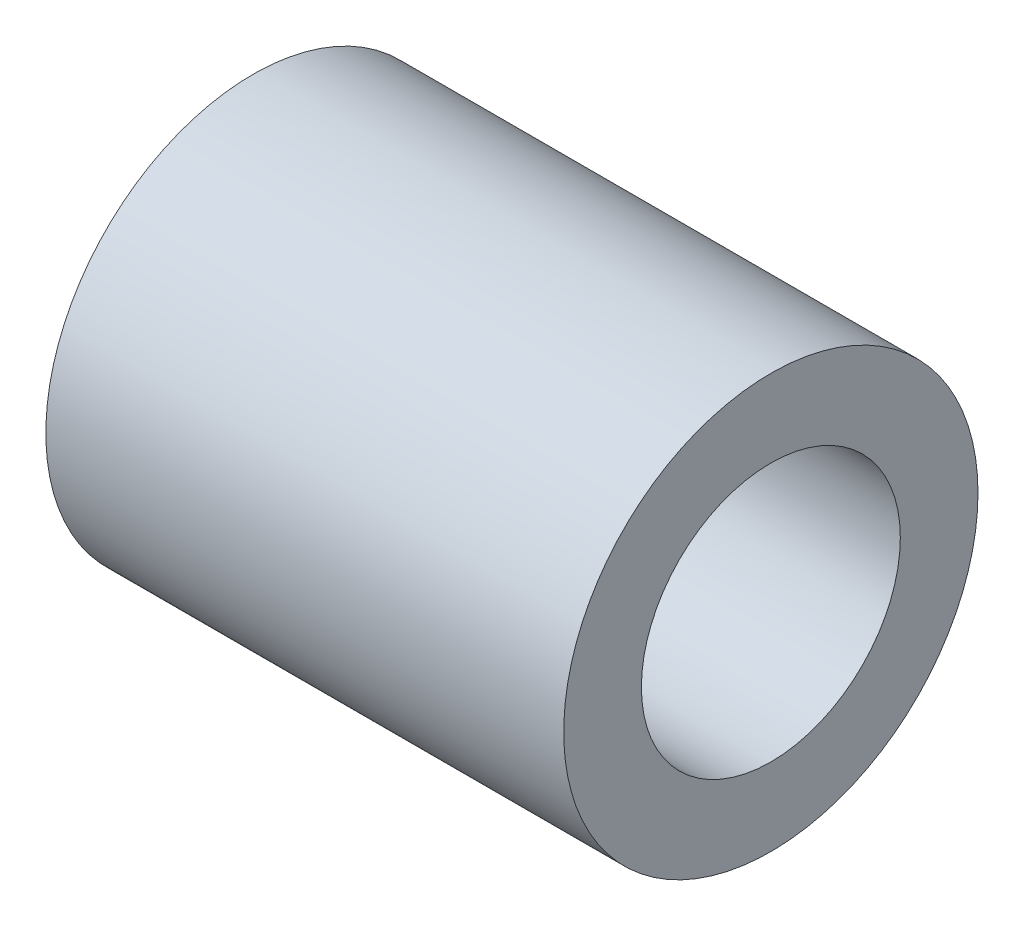
ISO-10303-21;
HEADER;
FILE_DESCRIPTION(('STEP AP214'),'2;1');
FILE_NAME('part.step','',(''),(''),'','','');
FILE_SCHEMA(('AUTOMOTIVE_DESIGN { 1 0 10303 214 1 1 1 1 }'));
ENDSEC;
DATA;
#1=APPLICATION_CONTEXT('core data for automotive mechanical design processes');
#2=APPLICATION_PROTOCOL_DEFINITION('international standard','automotive_design',2000,#1);
#3=PRODUCT_CONTEXT('',#1,'mechanical');
#4=PRODUCT('Part','Part','',(#3));
#5=PRODUCT_RELATED_PRODUCT_CATEGORY('part','',(#4));
#6=PRODUCT_DEFINITION_FORMATION('','',#4);
#7=PRODUCT_DEFINITION_CONTEXT('part definition',#1,'design');
#8=PRODUCT_DEFINITION('design','',#6,#7);
#9=PRODUCT_DEFINITION_SHAPE('','',#8);
#10=(LENGTH_UNIT() NAMED_UNIT(*) SI_UNIT(.MILLI.,.METRE.));
#11=(NAMED_UNIT(*) PLANE_ANGLE_UNIT() SI_UNIT($,.RADIAN.));
#12=(NAMED_UNIT(*) SI_UNIT($,.STERADIAN.) SOLID_ANGLE_UNIT());
#13=UNCERTAINTY_MEASURE_WITH_UNIT(LENGTH_MEASURE(1.E-05),#10,'distance_accuracy_value','');
#14=(GEOMETRIC_REPRESENTATION_CONTEXT(3) GLOBAL_UNCERTAINTY_ASSIGNED_CONTEXT((#13)) GLOBAL_UNIT_ASSIGNED_CONTEXT((#10,
#11,#12)) REPRESENTATION_CONTEXT('',''));
#15=CARTESIAN_POINT('',(0.,0.,0.));
#16=DIRECTION('',(0.,0.,1.));
#17=DIRECTION('',(1.,0.,0.));
#18=AXIS2_PLACEMENT_3D('',#15,#16,#17);
#19=CARTESIAN_POINT('',(20.,0.,0.));
#20=DIRECTION('',(1.,0.,0.));
#21=DIRECTION('',(0.,0.,-1.));
#22=AXIS2_PLACEMENT_3D('',#19,#20,#21);
#23=PLANE('',#22);
#24=CARTESIAN_POINT('',(20.,0.,0.));
#25=DIRECTION('',(1.,0.,0.));
#26=DIRECTION('',(0.,0.,-1.));
#27=AXIS2_PLACEMENT_3D('',#24,#25,#26);
#28=CIRCLE('',#27,8.);
#29=CARTESIAN_POINT('',(20.,0.,-8.));
#30=VERTEX_POINT('',#29);
#31=EDGE_CURVE('E10',#30,#30,#28,.T.);
#32=ORIENTED_EDGE('',*,*,#31,.T.);
#33=EDGE_LOOP('',(#32));
#34=FACE_BOUND('',#33,.T.);
#35=CARTESIAN_POINT('',(20.,0.,0.));
#36=DIRECTION('',(1.,0.,0.));
#37=DIRECTION('',(0.,0.,-1.));
#38=AXIS2_PLACEMENT_3D('',#35,#36,#37);
#39=CIRCLE('',#38,5.);
#40=CARTESIAN_POINT('',(20.,0.,-5.));
#41=VERTEX_POINT('',#40);
#42=EDGE_CURVE('E42',#41,#41,#39,.T.);
#43=ORIENTED_EDGE('',*,*,#42,.F.);
#44=EDGE_LOOP('',(#43));
#45=FACE_BOUND('',#44,.T.);
#46=ADVANCED_FACE('F31',(#34,#45),#23,.T.);
#47=CARTESIAN_POINT('',(0.,0.,0.));
#48=DIRECTION('',(1.,0.,0.));
#49=DIRECTION('',(0.,0.,-1.));
#50=AXIS2_PLACEMENT_3D('',#47,#48,#49);
#51=PLANE('',#50);
#52=CARTESIAN_POINT('',(0.,0.,0.));
#53=DIRECTION('',(1.,0.,0.));
#54=DIRECTION('',(0.,0.,-1.));
#55=AXIS2_PLACEMENT_3D('',#52,#53,#54);
#56=CIRCLE('',#55,8.);
#57=CARTESIAN_POINT('',(0.,0.,-8.));
#58=VERTEX_POINT('',#57);
#59=EDGE_CURVE('E35',#58,#58,#56,.T.);
#60=ORIENTED_EDGE('',*,*,#59,.F.);
#61=EDGE_LOOP('',(#60));
#62=FACE_BOUND('',#61,.T.);
#63=CARTESIAN_POINT('',(0.,0.,0.));
#64=DIRECTION('',(1.,0.,0.));
#65=DIRECTION('',(0.,0.,-1.));
#66=AXIS2_PLACEMENT_3D('',#63,#64,#65);
#67=CIRCLE('',#66,5.);
#68=CARTESIAN_POINT('',(0.,0.,-5.));
#69=VERTEX_POINT('',#68);
#70=EDGE_CURVE('E44',#69,#69,#67,.T.);
#71=ORIENTED_EDGE('',*,*,#70,.T.);
#72=EDGE_LOOP('',(#71));
#73=FACE_BOUND('',#72,.T.);
#74=ADVANCED_FACE('F54',(#62,#73),#51,.F.);
#75=CARTESIAN_POINT('',(20.,0.,0.));
#76=DIRECTION('',(-1.,0.,0.));
#77=DIRECTION('',(0.,0.,1.));
#78=AXIS2_PLACEMENT_3D('',#75,#76,#77);
#79=CYLINDRICAL_SURFACE('',#78,8.);
#80=ORIENTED_EDGE('',*,*,#31,.F.);
#81=EDGE_LOOP('',(#80));
#82=FACE_BOUND('',#81,.T.);
#83=ORIENTED_EDGE('',*,*,#59,.T.);
#84=EDGE_LOOP('',(#83));
#85=FACE_BOUND('',#84,.T.);
#86=ADVANCED_FACE('F33',(#82,#85),#79,.T.);
#87=CARTESIAN_POINT('',(20.,0.,0.));
#88=DIRECTION('',(-1.,0.,0.));
#89=DIRECTION('',(0.,0.,1.));
#90=AXIS2_PLACEMENT_3D('',#87,#88,#89);
#91=CYLINDRICAL_SURFACE('',#90,5.);
#92=ORIENTED_EDGE('',*,*,#42,.T.);
#93=EDGE_LOOP('',(#92));
#94=FACE_BOUND('',#93,.T.);
#95=ORIENTED_EDGE('',*,*,#70,.F.);
#96=EDGE_LOOP('',(#95));
#97=FACE_BOUND('',#96,.T.);
#98=ADVANCED_FACE('F50',(#94,#97),#91,.F.);
#99=CLOSED_SHELL('',(#46,#74,#86,#98));
#100=MANIFOLD_SOLID_BREP('B2',#99);
#101=ADVANCED_BREP_SHAPE_REPRESENTATION('',(#18,#100),#14);
#102=SHAPE_DEFINITION_REPRESENTATION(#9,#101);
ENDSEC;
END-ISO-10303-21;
